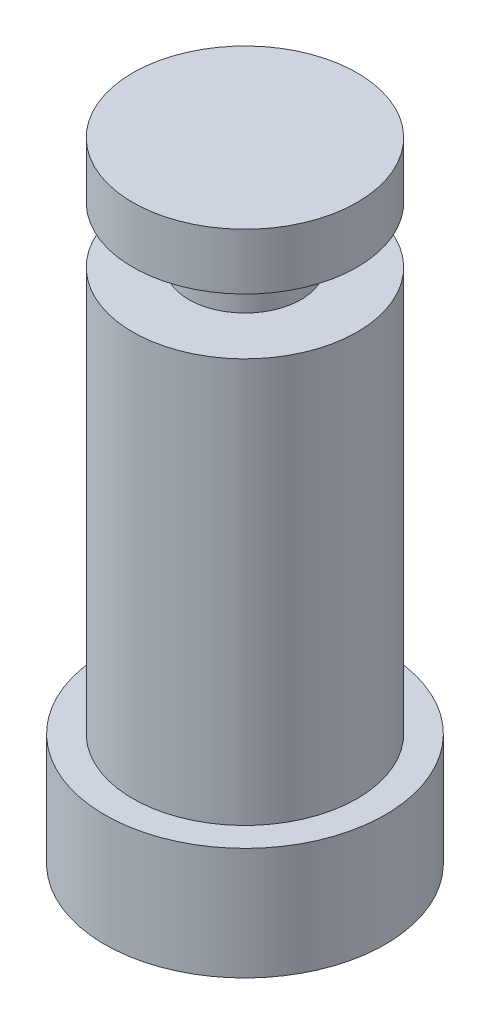
ISO-10303-21;
HEADER;
FILE_DESCRIPTION(('STEP AP214'),'2;1');
FILE_NAME('part.step','',(''),(''),'','','');
FILE_SCHEMA(('AUTOMOTIVE_DESIGN { 1 0 10303 214 1 1 1 1 }'));
ENDSEC;
DATA;
#1=APPLICATION_CONTEXT('core data for automotive mechanical design processes');
#2=APPLICATION_PROTOCOL_DEFINITION('international standard','automotive_design',2000,#1);
#3=PRODUCT_CONTEXT('',#1,'mechanical');
#4=PRODUCT('Part','Part','',(#3));
#5=PRODUCT_RELATED_PRODUCT_CATEGORY('part','',(#4));
#6=PRODUCT_DEFINITION_FORMATION('','',#4);
#7=PRODUCT_DEFINITION_CONTEXT('part definition',#1,'design');
#8=PRODUCT_DEFINITION('design','',#6,#7);
#9=PRODUCT_DEFINITION_SHAPE('','',#8);
#10=(LENGTH_UNIT() NAMED_UNIT(*) SI_UNIT(.MILLI.,.METRE.));
#11=(NAMED_UNIT(*) PLANE_ANGLE_UNIT() SI_UNIT($,.RADIAN.));
#12=(NAMED_UNIT(*) SI_UNIT($,.STERADIAN.) SOLID_ANGLE_UNIT());
#13=UNCERTAINTY_MEASURE_WITH_UNIT(LENGTH_MEASURE(1.E-05),#10,'distance_accuracy_value','');
#14=(GEOMETRIC_REPRESENTATION_CONTEXT(3) GLOBAL_UNCERTAINTY_ASSIGNED_CONTEXT((#13)) GLOBAL_UNIT_ASSIGNED_CONTEXT((#10,
#11,#12)) REPRESENTATION_CONTEXT('',''));
#15=CARTESIAN_POINT('',(0.,0.,0.));
#16=DIRECTION('',(0.,0.,1.));
#17=DIRECTION('',(1.,0.,0.));
#18=AXIS2_PLACEMENT_3D('',#15,#16,#17);
#19=CARTESIAN_POINT('',(0.,5.,0.));
#20=DIRECTION('',(0.,1.,0.));
#21=DIRECTION('',(-1.,0.,0.));
#22=AXIS2_PLACEMENT_3D('',#19,#20,#21);
#23=CYLINDRICAL_SURFACE('',#22,5.);
#24=CARTESIAN_POINT('',(0.,-23.,0.));
#25=DIRECTION('',(0.,1.,0.));
#26=DIRECTION('',(-1.,0.,0.));
#27=AXIS2_PLACEMENT_3D('',#24,#25,#26);
#28=CIRCLE('',#27,5.);
#29=CARTESIAN_POINT('',(-5.,-23.,0.));
#30=VERTEX_POINT('',#29);
#31=EDGE_CURVE('E46',#30,#30,#28,.T.);
#32=ORIENTED_EDGE('',*,*,#31,.T.);
#33=EDGE_LOOP('',(#32));
#34=FACE_BOUND('',#33,.T.);
#35=CARTESIAN_POINT('',(0.,-5.,0.));
#36=DIRECTION('',(0.,1.,0.));
#37=DIRECTION('',(-1.,0.,0.));
#38=AXIS2_PLACEMENT_3D('',#35,#36,#37);
#39=CIRCLE('',#38,5.);
#40=CARTESIAN_POINT('',(-5.,-5.,0.));
#41=VERTEX_POINT('',#40);
#42=EDGE_CURVE('E59',#41,#41,#39,.T.);
#43=ORIENTED_EDGE('',*,*,#42,.F.);
#44=EDGE_LOOP('',(#43));
#45=FACE_BOUND('',#44,.T.);
#46=ADVANCED_FACE('F39',(#34,#45),#23,.T.);
#47=CARTESIAN_POINT('',(5.,-23.,0.));
#48=DIRECTION('',(0.,-1.,0.));
#49=DIRECTION('',(1.,0.,0.));
#50=AXIS2_PLACEMENT_3D('',#47,#48,#49);
#51=PLANE('',#50);
#52=ORIENTED_EDGE('',*,*,#31,.F.);
#53=EDGE_LOOP('',(#52));
#54=FACE_BOUND('',#53,.T.);
#55=CARTESIAN_POINT('',(0.,-23.,0.));
#56=DIRECTION('',(0.,1.,0.));
#57=DIRECTION('',(-1.,0.,0.));
#58=AXIS2_PLACEMENT_3D('',#55,#56,#57);
#59=CIRCLE('',#58,6.25);
#60=CARTESIAN_POINT('',(-6.25,-23.,0.));
#61=VERTEX_POINT('',#60);
#62=EDGE_CURVE('E50',#61,#61,#59,.T.);
#63=ORIENTED_EDGE('',*,*,#62,.T.);
#64=EDGE_LOOP('',(#63));
#65=FACE_BOUND('',#64,.T.);
#66=ADVANCED_FACE('F88',(#54,#65),#51,.F.);
#67=CARTESIAN_POINT('',(0.,5.,0.));
#68=DIRECTION('',(0.,1.,0.));
#69=DIRECTION('',(-1.,0.,0.));
#70=AXIS2_PLACEMENT_3D('',#67,#68,#69);
#71=CYLINDRICAL_SURFACE('',#70,6.25);
#72=ORIENTED_EDGE('',*,*,#62,.F.);
#73=EDGE_LOOP('',(#72));
#74=FACE_BOUND('',#73,.T.);
#75=CARTESIAN_POINT('',(0.,-28.,0.));
#76=DIRECTION('',(0.,1.,0.));
#77=DIRECTION('',(-1.,0.,0.));
#78=AXIS2_PLACEMENT_3D('',#75,#76,#77);
#79=CIRCLE('',#78,6.25);
#80=CARTESIAN_POINT('',(-6.25,-28.,0.));
#81=VERTEX_POINT('',#80);
#82=EDGE_CURVE('E54',#81,#81,#79,.T.);
#83=ORIENTED_EDGE('',*,*,#82,.T.);
#84=EDGE_LOOP('',(#83));
#85=FACE_BOUND('',#84,.T.);
#86=ADVANCED_FACE('F94',(#74,#85),#71,.T.);
#87=CARTESIAN_POINT('',(6.25000000000001,-28.,0.));
#88=DIRECTION('',(0.,1.,0.));
#89=DIRECTION('',(-1.,0.,0.));
#90=AXIS2_PLACEMENT_3D('',#87,#88,#89);
#91=PLANE('',#90);
#92=ORIENTED_EDGE('',*,*,#82,.F.);
#93=EDGE_LOOP('',(#92));
#94=FACE_BOUND('',#93,.T.);
#95=ADVANCED_FACE('F108',(#94),#91,.F.);
#96=CARTESIAN_POINT('',(5.,-5.,0.));
#97=DIRECTION('',(0.,1.,0.));
#98=DIRECTION('',(-1.,0.,0.));
#99=AXIS2_PLACEMENT_3D('',#96,#97,#98);
#100=PLANE('',#99);
#101=ORIENTED_EDGE('',*,*,#42,.T.);
#102=EDGE_LOOP('',(#101));
#103=FACE_BOUND('',#102,.T.);
#104=CARTESIAN_POINT('',(0.,-5.,0.));
#105=DIRECTION('',(0.,1.,0.));
#106=DIRECTION('',(-1.,0.,0.));
#107=AXIS2_PLACEMENT_3D('',#104,#105,#106);
#108=CIRCLE('',#107,2.5);
#109=CARTESIAN_POINT('',(-2.5,-5.,0.));
#110=VERTEX_POINT('',#109);
#111=EDGE_CURVE('E62',#110,#110,#108,.T.);
#112=ORIENTED_EDGE('',*,*,#111,.F.);
#113=EDGE_LOOP('',(#112));
#114=FACE_BOUND('',#113,.T.);
#115=ADVANCED_FACE('F84',(#103,#114),#100,.T.);
#116=CARTESIAN_POINT('',(0.,0.,0.));
#117=DIRECTION('',(0.,1.,0.));
#118=DIRECTION('',(-1.,0.,0.));
#119=AXIS2_PLACEMENT_3D('',#116,#117,#118);
#120=CYLINDRICAL_SURFACE('',#119,2.5);
#121=ORIENTED_EDGE('',*,*,#111,.T.);
#122=EDGE_LOOP('',(#121));
#123=FACE_BOUND('',#122,.T.);
#124=CARTESIAN_POINT('',(0.,-2.5,0.));
#125=DIRECTION('',(0.,1.,0.));
#126=DIRECTION('',(-1.,0.,0.));
#127=AXIS2_PLACEMENT_3D('',#124,#125,#126);
#128=CIRCLE('',#127,2.5);
#129=CARTESIAN_POINT('',(-2.5,-2.5,0.));
#130=VERTEX_POINT('',#129);
#131=EDGE_CURVE('E65',#130,#130,#128,.T.);
#132=ORIENTED_EDGE('',*,*,#131,.F.);
#133=EDGE_LOOP('',(#132));
#134=FACE_BOUND('',#133,.T.);
#135=ADVANCED_FACE('F76',(#123,#134),#120,.T.);
#136=CARTESIAN_POINT('',(5.,-2.5,0.));
#137=DIRECTION('',(0.,-1.,0.));
#138=DIRECTION('',(1.,0.,0.));
#139=AXIS2_PLACEMENT_3D('',#136,#137,#138);
#140=PLANE('',#139);
#141=ORIENTED_EDGE('',*,*,#131,.T.);
#142=EDGE_LOOP('',(#141));
#143=FACE_BOUND('',#142,.T.);
#144=CARTESIAN_POINT('',(0.,-2.5,0.));
#145=DIRECTION('',(0.,1.,0.));
#146=DIRECTION('',(-1.,0.,0.));
#147=AXIS2_PLACEMENT_3D('',#144,#145,#146);
#148=CIRCLE('',#147,5.);
#149=CARTESIAN_POINT('',(-5.,-2.5,0.));
#150=VERTEX_POINT('',#149);
#151=EDGE_CURVE('E68',#150,#150,#148,.T.);
#152=ORIENTED_EDGE('',*,*,#151,.F.);
#153=EDGE_LOOP('',(#152));
#154=FACE_BOUND('',#153,.T.);
#155=ADVANCED_FACE('F74',(#143,#154),#140,.T.);
#156=CARTESIAN_POINT('',(0.,0.,0.));
#157=DIRECTION('',(0.,-1.,0.));
#158=DIRECTION('',(1.,0.,0.));
#159=AXIS2_PLACEMENT_3D('',#156,#157,#158);
#160=PLANE('',#159);
#161=CARTESIAN_POINT('',(0.,0.,0.));
#162=DIRECTION('',(0.,1.,0.));
#163=DIRECTION('',(-1.,0.,0.));
#164=AXIS2_PLACEMENT_3D('',#161,#162,#163);
#165=CIRCLE('',#164,5.);
#166=CARTESIAN_POINT('',(-5.,0.,0.));
#167=VERTEX_POINT('',#166);
#168=EDGE_CURVE('E10',#167,#167,#165,.T.);
#169=ORIENTED_EDGE('',*,*,#168,.T.);
#170=EDGE_LOOP('',(#169));
#171=FACE_BOUND('',#170,.T.);
#172=ADVANCED_FACE('F41',(#171),#160,.F.);
#173=ORIENTED_EDGE('',*,*,#168,.F.);
#174=EDGE_LOOP('',(#173));
#175=FACE_BOUND('',#174,.T.);
#176=ORIENTED_EDGE('',*,*,#151,.T.);
#177=EDGE_LOOP('',(#176));
#178=FACE_BOUND('',#177,.T.);
#179=ADVANCED_FACE('F72',(#175,#178),#23,.T.);
#180=CLOSED_SHELL('',(#46,#66,#86,#95,#115,#135,#155,#172,#179));
#181=MANIFOLD_SOLID_BREP('B2',#180);
#182=ADVANCED_BREP_SHAPE_REPRESENTATION('',(#18,#181),#14);
#183=SHAPE_DEFINITION_REPRESENTATION(#9,#182);
ENDSEC;
END-ISO-10303-21;
